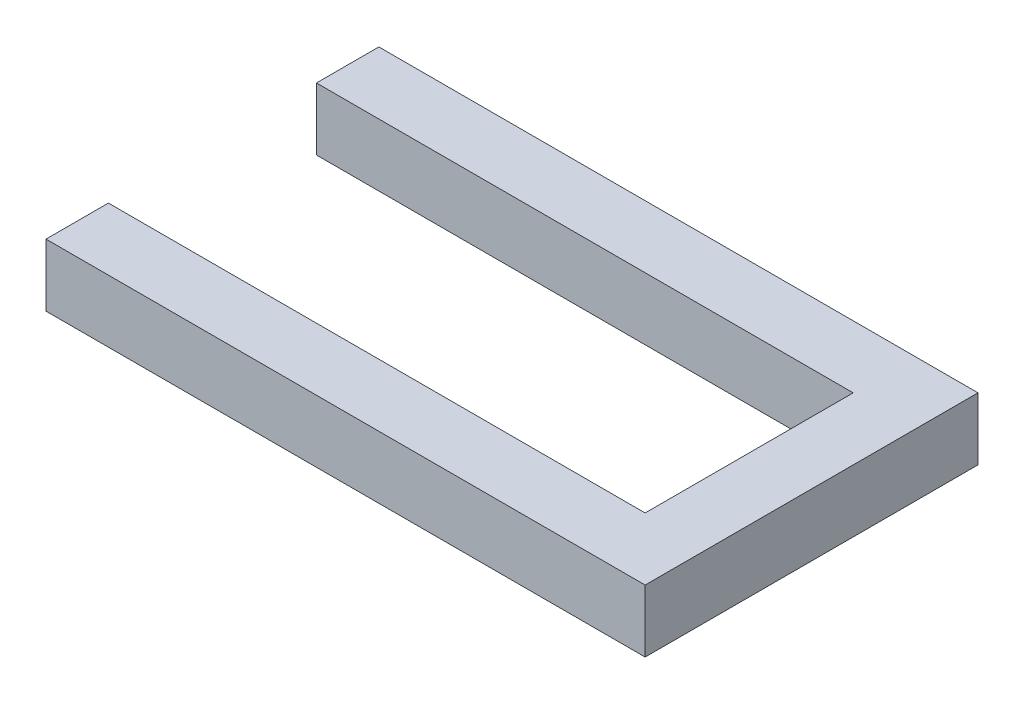
ISO-10303-21;
HEADER;
FILE_DESCRIPTION(('STEP AP214'),'2;1');
FILE_NAME('part.step','',(''),(''),'','','');
FILE_SCHEMA(('AUTOMOTIVE_DESIGN { 1 0 10303 214 1 1 1 1 }'));
ENDSEC;
DATA;
#1=APPLICATION_CONTEXT('core data for automotive mechanical design processes');
#2=APPLICATION_PROTOCOL_DEFINITION('international standard','automotive_design',2000,#1);
#3=PRODUCT_CONTEXT('',#1,'mechanical');
#4=PRODUCT('Part','Part','',(#3));
#5=PRODUCT_RELATED_PRODUCT_CATEGORY('part','',(#4));
#6=PRODUCT_DEFINITION_FORMATION('','',#4);
#7=PRODUCT_DEFINITION_CONTEXT('part definition',#1,'design');
#8=PRODUCT_DEFINITION('design','',#6,#7);
#9=PRODUCT_DEFINITION_SHAPE('','',#8);
#10=(LENGTH_UNIT() NAMED_UNIT(*) SI_UNIT(.MILLI.,.METRE.));
#11=(NAMED_UNIT(*) PLANE_ANGLE_UNIT() SI_UNIT($,.RADIAN.));
#12=(NAMED_UNIT(*) SI_UNIT($,.STERADIAN.) SOLID_ANGLE_UNIT());
#13=UNCERTAINTY_MEASURE_WITH_UNIT(LENGTH_MEASURE(1.E-05),#10,'distance_accuracy_value','');
#14=(GEOMETRIC_REPRESENTATION_CONTEXT(3) GLOBAL_UNCERTAINTY_ASSIGNED_CONTEXT((#13)) GLOBAL_UNIT_ASSIGNED_CONTEXT((#10,
#11,#12)) REPRESENTATION_CONTEXT('',''));
#15=CARTESIAN_POINT('',(0.,0.,0.));
#16=DIRECTION('',(0.,0.,1.));
#17=DIRECTION('',(1.,0.,0.));
#18=AXIS2_PLACEMENT_3D('',#15,#16,#17);
#19=CARTESIAN_POINT('',(-38.1,0.,-101.6));
#20=DIRECTION('',(-1.,0.,0.));
#21=DIRECTION('',(0.,0.,1.));
#22=AXIS2_PLACEMENT_3D('',#19,#20,#21);
#23=PLANE('',#22);
#24=DIRECTION('',(0.,0.,1.));
#25=VECTOR('',#24,1.);
#26=CARTESIAN_POINT('',(-38.1,-38.1,-101.6));
#27=LINE('',#26,#25);
#28=CARTESIAN_POINT('',(-38.1,-38.1,-63.5));
#29=VERTEX_POINT('',#28);
#30=CARTESIAN_POINT('',(-38.1,-38.1,63.5));
#31=VERTEX_POINT('',#30);
#32=EDGE_CURVE('E109',#29,#31,#27,.T.);
#33=ORIENTED_EDGE('',*,*,#32,.T.);
#34=DIRECTION('',(0.,-1.,0.));
#35=VECTOR('',#34,1.);
#36=CARTESIAN_POINT('',(-38.1,-38.1,63.5));
#37=LINE('',#36,#35);
#38=CARTESIAN_POINT('',(-38.1,0.,63.5));
#39=VERTEX_POINT('',#38);
#40=EDGE_CURVE('E102',#39,#31,#37,.T.);
#41=ORIENTED_EDGE('',*,*,#40,.F.);
#42=DIRECTION('',(0.,0.,1.));
#43=VECTOR('',#42,1.);
#44=CARTESIAN_POINT('',(-38.1,0.,-101.6));
#45=LINE('',#44,#43);
#46=CARTESIAN_POINT('',(-38.1,0.,-63.5));
#47=VERTEX_POINT('',#46);
#48=EDGE_CURVE('E11',#47,#39,#45,.T.);
#49=ORIENTED_EDGE('',*,*,#48,.F.);
#50=DIRECTION('',(0.,1.,0.));
#51=VECTOR('',#50,1.);
#52=CARTESIAN_POINT('',(-38.1,-38.1,-63.5));
#53=LINE('',#52,#51);
#54=EDGE_CURVE('E47',#29,#47,#53,.T.);
#55=ORIENTED_EDGE('',*,*,#54,.F.);
#56=EDGE_LOOP('',(#33,#41,#49,#55));
#57=FACE_BOUND('',#56,.T.);
#58=ADVANCED_FACE('F31',(#57),#23,.T.);
#59=CARTESIAN_POINT('',(-38.1,0.,-101.6));
#60=DIRECTION('',(0.,1.,0.));
#61=DIRECTION('',(0.,0.,1.));
#62=AXIS2_PLACEMENT_3D('',#59,#60,#61);
#63=PLANE('',#62);
#64=DIRECTION('',(-1.,0.,0.));
#65=VECTOR('',#64,1.);
#66=CARTESIAN_POINT('',(-38.1,0.,-101.6));
#67=LINE('',#66,#65);
#68=CARTESIAN_POINT('',(0.,0.,-101.6));
#69=VERTEX_POINT('',#68);
#70=CARTESIAN_POINT('',(-365.760000010038,-1.79023462726291E-13,-101.6));
#71=VERTEX_POINT('',#70);
#72=EDGE_CURVE('E152',#69,#71,#67,.T.);
#73=ORIENTED_EDGE('',*,*,#72,.T.);
#74=DIRECTION('',(0.,0.,1.));
#75=VECTOR('',#74,1.);
#76=CARTESIAN_POINT('',(-365.760000010038,-1.79023462726291E-13,-101.6));
#77=LINE('',#76,#75);
#78=CARTESIAN_POINT('',(-365.760000010038,-1.79023462726291E-13,-63.5));
#79=VERTEX_POINT('',#78);
#80=EDGE_CURVE('E116',#71,#79,#77,.T.);
#81=ORIENTED_EDGE('',*,*,#80,.T.);
#82=DIRECTION('',(1.,0.,0.));
#83=VECTOR('',#82,1.);
#84=CARTESIAN_POINT('',(-419.641536736452,-2.08462696326611E-13,-63.5));
#85=LINE('',#84,#83);
#86=EDGE_CURVE('E114',#79,#47,#85,.T.);
#87=ORIENTED_EDGE('',*,*,#86,.T.);
#88=ORIENTED_EDGE('',*,*,#48,.T.);
#89=DIRECTION('',(1.,0.,0.));
#90=VECTOR('',#89,1.);
#91=CARTESIAN_POINT('',(-419.641536736452,-2.08462696326611E-13,63.5));
#92=LINE('',#91,#90);
#93=CARTESIAN_POINT('',(-365.760000010038,0.,63.5));
#94=VERTEX_POINT('',#93);
#95=EDGE_CURVE('E98',#94,#39,#92,.T.);
#96=ORIENTED_EDGE('',*,*,#95,.F.);
#97=DIRECTION('',(0.,0.,1.));
#98=VECTOR('',#97,1.);
#99=CARTESIAN_POINT('',(-365.760000010038,-1.79023462726291E-13,101.6));
#100=LINE('',#99,#98);
#101=CARTESIAN_POINT('',(-365.760000010038,-1.79023462726291E-13,101.6));
#102=VERTEX_POINT('',#101);
#103=EDGE_CURVE('E127',#94,#102,#100,.T.);
#104=ORIENTED_EDGE('',*,*,#103,.T.);
#105=DIRECTION('',(-1.,0.,0.));
#106=VECTOR('',#105,1.);
#107=CARTESIAN_POINT('',(-38.1,0.,101.6));
#108=LINE('',#107,#106);
#109=CARTESIAN_POINT('',(0.,0.,101.6));
#110=VERTEX_POINT('',#109);
#111=EDGE_CURVE('E145',#110,#102,#108,.T.);
#112=ORIENTED_EDGE('',*,*,#111,.F.);
#113=DIRECTION('',(0.,0.,1.));
#114=VECTOR('',#113,1.);
#115=CARTESIAN_POINT('',(0.,0.,-101.6));
#116=LINE('',#115,#114);
#117=EDGE_CURVE('E39',#69,#110,#116,.T.);
#118=ORIENTED_EDGE('',*,*,#117,.F.);
#119=EDGE_LOOP('',(#73,#81,#87,#88,#96,#104,#112,#118));
#120=FACE_BOUND('',#119,.T.);
#121=ADVANCED_FACE('F111',(#120),#63,.T.);
#122=CARTESIAN_POINT('',(0.,0.,-101.6));
#123=DIRECTION('',(1.,0.,0.));
#124=DIRECTION('',(0.,0.,-1.));
#125=AXIS2_PLACEMENT_3D('',#122,#123,#124);
#126=PLANE('',#125);
#127=ORIENTED_EDGE('',*,*,#117,.T.);
#128=DIRECTION('',(0.,1.,0.));
#129=VECTOR('',#128,1.);
#130=CARTESIAN_POINT('',(0.,0.,101.6));
#131=LINE('',#130,#129);
#132=CARTESIAN_POINT('',(0.,-38.1,101.6));
#133=VERTEX_POINT('',#132);
#134=EDGE_CURVE('E142',#133,#110,#131,.T.);
#135=ORIENTED_EDGE('',*,*,#134,.F.);
#136=DIRECTION('',(0.,0.,1.));
#137=VECTOR('',#136,1.);
#138=CARTESIAN_POINT('',(0.,-38.1,-101.6));
#139=LINE('',#138,#137);
#140=CARTESIAN_POINT('',(0.,-38.1,-101.6));
#141=VERTEX_POINT('',#140);
#142=EDGE_CURVE('E159',#141,#133,#139,.T.);
#143=ORIENTED_EDGE('',*,*,#142,.F.);
#144=DIRECTION('',(0.,1.,0.));
#145=VECTOR('',#144,1.);
#146=CARTESIAN_POINT('',(0.,0.,-101.6));
#147=LINE('',#146,#145);
#148=EDGE_CURVE('E150',#141,#69,#147,.T.);
#149=ORIENTED_EDGE('',*,*,#148,.T.);
#150=EDGE_LOOP('',(#127,#135,#143,#149));
#151=FACE_BOUND('',#150,.T.);
#152=ADVANCED_FACE('F164',(#151),#126,.T.);
#153=CARTESIAN_POINT('',(-38.1,-38.1,-101.6));
#154=DIRECTION('',(0.,-1.,0.));
#155=DIRECTION('',(0.,0.,-1.));
#156=AXIS2_PLACEMENT_3D('',#153,#154,#155);
#157=PLANE('',#156);
#158=ORIENTED_EDGE('',*,*,#142,.T.);
#159=DIRECTION('',(1.,0.,0.));
#160=VECTOR('',#159,1.);
#161=CARTESIAN_POINT('',(-38.1,-38.1,101.6));
#162=LINE('',#161,#160);
#163=CARTESIAN_POINT('',(-365.760000010037,-38.1000000000002,101.6));
#164=VERTEX_POINT('',#163);
#165=EDGE_CURVE('E139',#164,#133,#162,.T.);
#166=ORIENTED_EDGE('',*,*,#165,.F.);
#167=DIRECTION('',(0.,0.,-1.));
#168=VECTOR('',#167,1.);
#169=CARTESIAN_POINT('',(-365.760000010037,-38.1000000000002,101.6));
#170=LINE('',#169,#168);
#171=CARTESIAN_POINT('',(-365.760000010037,-38.1000000000002,63.5));
#172=VERTEX_POINT('',#171);
#173=EDGE_CURVE('E105',#164,#172,#170,.T.);
#174=ORIENTED_EDGE('',*,*,#173,.T.);
#175=DIRECTION('',(1.,0.,0.));
#176=VECTOR('',#175,1.);
#177=CARTESIAN_POINT('',(-419.641536736452,-38.1000000000002,63.5));
#178=LINE('',#177,#176);
#179=EDGE_CURVE('E106',#172,#31,#178,.T.);
#180=ORIENTED_EDGE('',*,*,#179,.T.);
#181=ORIENTED_EDGE('',*,*,#32,.F.);
#182=DIRECTION('',(1.,0.,0.));
#183=VECTOR('',#182,1.);
#184=CARTESIAN_POINT('',(-419.641536736452,-38.1000000000002,-63.5));
#185=LINE('',#184,#183);
#186=CARTESIAN_POINT('',(-365.760000010037,-38.1000000000002,-63.5));
#187=VERTEX_POINT('',#186);
#188=EDGE_CURVE('E119',#187,#29,#185,.T.);
#189=ORIENTED_EDGE('',*,*,#188,.F.);
#190=DIRECTION('',(0.,0.,-1.));
#191=VECTOR('',#190,1.);
#192=CARTESIAN_POINT('',(-365.760000010037,-38.1000000000002,-101.6));
#193=LINE('',#192,#191);
#194=CARTESIAN_POINT('',(-365.760000010037,-38.1000000000002,-101.6));
#195=VERTEX_POINT('',#194);
#196=EDGE_CURVE('E177',#187,#195,#193,.T.);
#197=ORIENTED_EDGE('',*,*,#196,.T.);
#198=DIRECTION('',(1.,0.,0.));
#199=VECTOR('',#198,1.);
#200=CARTESIAN_POINT('',(-38.1,-38.1,-101.6));
#201=LINE('',#200,#199);
#202=EDGE_CURVE('E147',#195,#141,#201,.T.);
#203=ORIENTED_EDGE('',*,*,#202,.T.);
#204=EDGE_LOOP('',(#158,#166,#174,#180,#181,#189,#197,#203));
#205=FACE_BOUND('',#204,.T.);
#206=ADVANCED_FACE('F185',(#205),#157,.T.);
#207=CARTESIAN_POINT('',(-38.1,-38.1,-101.6));
#208=DIRECTION('',(0.,0.,1.));
#209=DIRECTION('',(1.,0.,0.));
#210=AXIS2_PLACEMENT_3D('',#207,#208,#209);
#211=PLANE('',#210);
#212=ORIENTED_EDGE('',*,*,#202,.F.);
#213=DIRECTION('',(0.,1.,0.));
#214=VECTOR('',#213,1.);
#215=CARTESIAN_POINT('',(-365.760000010037,-38.0999999999978,-101.6));
#216=LINE('',#215,#214);
#217=EDGE_CURVE('E135',#195,#71,#216,.T.);
#218=ORIENTED_EDGE('',*,*,#217,.T.);
#219=ORIENTED_EDGE('',*,*,#72,.F.);
#220=ORIENTED_EDGE('',*,*,#148,.F.);
#221=EDGE_LOOP('',(#212,#218,#219,#220));
#222=FACE_BOUND('',#221,.T.);
#223=ADVANCED_FACE('F182',(#222),#211,.F.);
#224=CARTESIAN_POINT('',(-38.1,-38.1,101.6));
#225=DIRECTION('',(0.,0.,1.));
#226=DIRECTION('',(1.,0.,0.));
#227=AXIS2_PLACEMENT_3D('',#224,#225,#226);
#228=PLANE('',#227);
#229=ORIENTED_EDGE('',*,*,#111,.T.);
#230=DIRECTION('',(0.,-1.,0.));
#231=VECTOR('',#230,1.);
#232=CARTESIAN_POINT('',(-365.760000010037,-38.0999999999978,101.6));
#233=LINE('',#232,#231);
#234=EDGE_CURVE('E124',#102,#164,#233,.T.);
#235=ORIENTED_EDGE('',*,*,#234,.T.);
#236=ORIENTED_EDGE('',*,*,#165,.T.);
#237=ORIENTED_EDGE('',*,*,#134,.T.);
#238=EDGE_LOOP('',(#229,#235,#236,#237));
#239=FACE_BOUND('',#238,.T.);
#240=ADVANCED_FACE('F168',(#239),#228,.T.);
#241=CARTESIAN_POINT('',(-419.641536736452,-38.1000000000002,-63.5));
#242=DIRECTION('',(0.,0.,-1.));
#243=DIRECTION('',(-1.,0.,0.));
#244=AXIS2_PLACEMENT_3D('',#241,#242,#243);
#245=PLANE('',#244);
#246=ORIENTED_EDGE('',*,*,#86,.F.);
#247=DIRECTION('',(0.,-1.,0.));
#248=VECTOR('',#247,1.);
#249=CARTESIAN_POINT('',(-365.760000010037,-38.0999999999978,-63.5));
#250=LINE('',#249,#248);
#251=EDGE_CURVE('E138',#79,#187,#250,.T.);
#252=ORIENTED_EDGE('',*,*,#251,.T.);
#253=ORIENTED_EDGE('',*,*,#188,.T.);
#254=ORIENTED_EDGE('',*,*,#54,.T.);
#255=EDGE_LOOP('',(#246,#252,#253,#254));
#256=FACE_BOUND('',#255,.T.);
#257=ADVANCED_FACE('F122',(#256),#245,.F.);
#258=CARTESIAN_POINT('',(-365.760000009958,-1817.37000000002,-749.299999999988));
#259=DIRECTION('',(1.,0.,0.));
#260=DIRECTION('',(0.,0.,-1.));
#261=AXIS2_PLACEMENT_3D('',#258,#259,#260);
#262=PLANE('',#261);
#263=ORIENTED_EDGE('',*,*,#196,.F.);
#264=ORIENTED_EDGE('',*,*,#251,.F.);
#265=ORIENTED_EDGE('',*,*,#80,.F.);
#266=ORIENTED_EDGE('',*,*,#217,.F.);
#267=EDGE_LOOP('',(#263,#264,#265,#266));
#268=FACE_BOUND('',#267,.T.);
#269=ADVANCED_FACE('F184',(#268),#262,.F.);
#270=CARTESIAN_POINT('',(-419.641536736452,-38.1000000000002,63.5));
#271=DIRECTION('',(0.,0.,1.));
#272=DIRECTION('',(1.,0.,0.));
#273=AXIS2_PLACEMENT_3D('',#270,#271,#272);
#274=PLANE('',#273);
#275=ORIENTED_EDGE('',*,*,#179,.F.);
#276=DIRECTION('',(0.,1.,0.));
#277=VECTOR('',#276,1.);
#278=CARTESIAN_POINT('',(-365.760000010037,-38.0999999999978,63.5));
#279=LINE('',#278,#277);
#280=EDGE_CURVE('E103',#172,#94,#279,.T.);
#281=ORIENTED_EDGE('',*,*,#280,.T.);
#282=ORIENTED_EDGE('',*,*,#95,.T.);
#283=ORIENTED_EDGE('',*,*,#40,.T.);
#284=EDGE_LOOP('',(#275,#281,#282,#283));
#285=FACE_BOUND('',#284,.T.);
#286=ADVANCED_FACE('F101',(#285),#274,.F.);
#287=CARTESIAN_POINT('',(-365.760000009958,-1817.37000000002,-749.299999999988));
#288=DIRECTION('',(1.,0.,0.));
#289=DIRECTION('',(0.,0.,-1.));
#290=AXIS2_PLACEMENT_3D('',#287,#288,#289);
#291=PLANE('',#290);
#292=ORIENTED_EDGE('',*,*,#103,.F.);
#293=ORIENTED_EDGE('',*,*,#280,.F.);
#294=ORIENTED_EDGE('',*,*,#173,.F.);
#295=ORIENTED_EDGE('',*,*,#234,.F.);
#296=EDGE_LOOP('',(#292,#293,#294,#295));
#297=FACE_BOUND('',#296,.T.);
#298=ADVANCED_FACE('F187',(#297),#291,.F.);
#299=CLOSED_SHELL('',(#58,#121,#152,#206,#223,#240,#257,#269,#286,#298));
#300=MANIFOLD_SOLID_BREP('B2',#299);
#301=ADVANCED_BREP_SHAPE_REPRESENTATION('',(#18,#300),#14);
#302=SHAPE_DEFINITION_REPRESENTATION(#9,#301);
ENDSEC;
END-ISO-10303-21;
